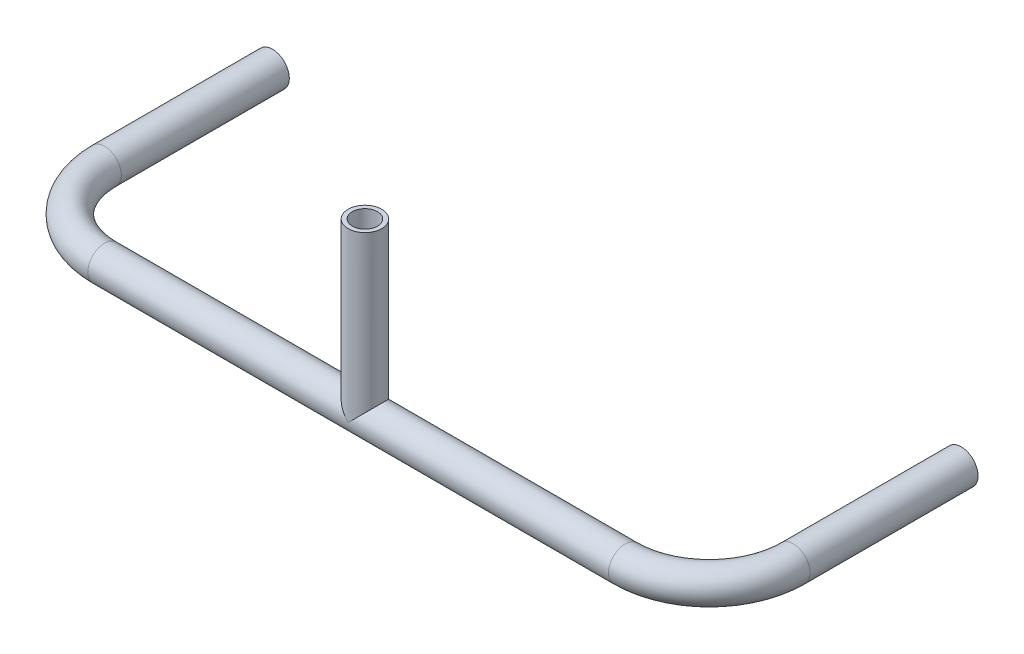
ISO-10303-21;
HEADER;
FILE_DESCRIPTION(('STEP AP214'),'2;1');
FILE_NAME('part.step','',(''),(''),'','','');
FILE_SCHEMA(('AUTOMOTIVE_DESIGN { 1 0 10303 214 1 1 1 1 }'));
ENDSEC;
DATA;
#1=APPLICATION_CONTEXT('core data for automotive mechanical design processes');
#2=APPLICATION_PROTOCOL_DEFINITION('international standard','automotive_design',2000,#1);
#3=PRODUCT_CONTEXT('',#1,'mechanical');
#4=PRODUCT('Part','Part','',(#3));
#5=PRODUCT_RELATED_PRODUCT_CATEGORY('part','',(#4));
#6=PRODUCT_DEFINITION_FORMATION('','',#4);
#7=PRODUCT_DEFINITION_CONTEXT('part definition',#1,'design');
#8=PRODUCT_DEFINITION('design','',#6,#7);
#9=PRODUCT_DEFINITION_SHAPE('','',#8);
#10=(LENGTH_UNIT() NAMED_UNIT(*) SI_UNIT(.MILLI.,.METRE.));
#11=(NAMED_UNIT(*) PLANE_ANGLE_UNIT() SI_UNIT($,.RADIAN.));
#12=(NAMED_UNIT(*) SI_UNIT($,.STERADIAN.) SOLID_ANGLE_UNIT());
#13=UNCERTAINTY_MEASURE_WITH_UNIT(LENGTH_MEASURE(1.E-05),#10,'distance_accuracy_value','');
#14=(GEOMETRIC_REPRESENTATION_CONTEXT(3) GLOBAL_UNCERTAINTY_ASSIGNED_CONTEXT((#13)) GLOBAL_UNIT_ASSIGNED_CONTEXT((#10,
#11,#12)) REPRESENTATION_CONTEXT('',''));
#15=CARTESIAN_POINT('',(0.,0.,0.));
#16=DIRECTION('',(0.,0.,1.));
#17=DIRECTION('',(1.,0.,0.));
#18=AXIS2_PLACEMENT_3D('',#15,#16,#17);
#19=CARTESIAN_POINT('',(-31.,0.,30.));
#20=DIRECTION('',(1.,0.,0.));
#21=DIRECTION('',(0.,0.,-1.));
#22=AXIS2_PLACEMENT_3D('',#19,#20,#21);
#23=CYLINDRICAL_SURFACE('',#22,2.);
#24=CARTESIAN_POINT('',(31.,0.,30.));
#25=DIRECTION('',(1.,0.,0.));
#26=DIRECTION('',(0.,0.,-1.));
#27=AXIS2_PLACEMENT_3D('',#24,#25,#26);
#28=CIRCLE('',#27,2.);
#29=CARTESIAN_POINT('',(31.,0.,32.));
#30=VERTEX_POINT('',#29);
#31=EDGE_CURVE('E123',#30,#30,#28,.T.);
#32=ORIENTED_EDGE('',*,*,#31,.F.);
#33=EDGE_LOOP('',(#32));
#34=FACE_BOUND('',#33,.T.);
#35=CARTESIAN_POINT('',(-31.,0.,30.));
#36=DIRECTION('',(1.,0.,0.));
#37=DIRECTION('',(0.,0.,-1.));
#38=AXIS2_PLACEMENT_3D('',#35,#36,#37);
#39=CIRCLE('',#38,2.);
#40=CARTESIAN_POINT('',(-31.,0.,32.));
#41=VERTEX_POINT('',#40);
#42=EDGE_CURVE('E92',#41,#41,#39,.T.);
#43=ORIENTED_EDGE('',*,*,#42,.T.);
#44=EDGE_LOOP('',(#43));
#45=FACE_BOUND('',#44,.T.);
#46=CARTESIAN_POINT('',(0.,0.,30.));
#47=DIRECTION('',(0.707106781186547,0.707106781186547,0.));
#48=DIRECTION('',(0.707106781186547,-0.707106781186547,0.));
#49=AXIS2_PLACEMENT_3D('',#46,#47,#48);
#50=ELLIPSE('',#49,2.82842712474619,2.);
#51=CARTESIAN_POINT('',(0.,0.,32.));
#52=VERTEX_POINT('',#51);
#53=CARTESIAN_POINT('',(0.,0.,28.));
#54=VERTEX_POINT('',#53);
#55=EDGE_CURVE('E81',#52,#54,#50,.F.);
#56=ORIENTED_EDGE('',*,*,#55,.T.);
#57=CARTESIAN_POINT('',(0.,0.,30.));
#58=DIRECTION('',(0.707106781186547,-0.707106781186547,0.));
#59=DIRECTION('',(0.707106781186547,0.707106781186547,0.));
#60=AXIS2_PLACEMENT_3D('',#57,#58,#59);
#61=ELLIPSE('',#60,2.82842712474619,2.);
#62=EDGE_CURVE('E85',#54,#52,#61,.T.);
#63=ORIENTED_EDGE('',*,*,#62,.T.);
#64=EDGE_LOOP('',(#56,#63));
#65=FACE_BOUND('',#64,.T.);
#66=ADVANCED_FACE('F33',(#34,#45,#65),#23,.T.);
#67=CARTESIAN_POINT('',(-31.,0.,30.));
#68=DIRECTION('',(1.,0.,0.));
#69=DIRECTION('',(0.,0.,-1.));
#70=AXIS2_PLACEMENT_3D('',#67,#68,#69);
#71=CYLINDRICAL_SURFACE('',#70,1.5);
#72=CARTESIAN_POINT('',(31.,0.,30.));
#73=DIRECTION('',(1.,0.,0.));
#74=DIRECTION('',(0.,0.,-1.));
#75=AXIS2_PLACEMENT_3D('',#72,#73,#74);
#76=CIRCLE('',#75,1.5);
#77=CARTESIAN_POINT('',(31.,0.,31.5));
#78=VERTEX_POINT('',#77);
#79=EDGE_CURVE('E105',#78,#78,#76,.F.);
#80=ORIENTED_EDGE('',*,*,#79,.F.);
#81=EDGE_LOOP('',(#80));
#82=FACE_BOUND('',#81,.T.);
#83=CARTESIAN_POINT('',(-31.,0.,30.));
#84=DIRECTION('',(1.,0.,0.));
#85=DIRECTION('',(0.,0.,-1.));
#86=AXIS2_PLACEMENT_3D('',#83,#84,#85);
#87=CIRCLE('',#86,1.5);
#88=CARTESIAN_POINT('',(-31.,0.,31.5));
#89=VERTEX_POINT('',#88);
#90=EDGE_CURVE('E102',#89,#89,#87,.F.);
#91=ORIENTED_EDGE('',*,*,#90,.T.);
#92=EDGE_LOOP('',(#91));
#93=FACE_BOUND('',#92,.T.);
#94=CARTESIAN_POINT('',(-1.32287565553229,0.,28.5));
#95=CARTESIAN_POINT('',(-1.3228472429083,0.0353540277200895,28.4999885169681));
#96=CARTESIAN_POINT('',(-1.32429221265618,0.0706884634475101,28.5012493349796));
#97=CARTESIAN_POINT('',(-1.32990588817293,0.140895201591939,28.506221233717));
#98=CARTESIAN_POINT('',(-1.33406891930621,0.175768312723147,28.5099272097313));
#99=CARTESIAN_POINT('',(-1.34482795294491,0.244336993641847,28.5196331506633));
#100=CARTESIAN_POINT('',(-1.35139206925062,0.278041929290358,28.5256030869254));
#101=CARTESIAN_POINT('',(-1.36661798881945,0.344516234957248,28.539704197805));
#102=CARTESIAN_POINT('',(-1.37528079832798,0.377285147736758,28.547836409336));
#103=CARTESIAN_POINT('',(-1.40370488220627,0.473407803270668,28.5751159164366));
#104=CARTESIAN_POINT('',(-1.42600935755767,0.535186087514595,28.5972364827325));
#105=CARTESIAN_POINT('',(-1.47476459266477,0.654137094366721,28.6485829654946));
#106=CARTESIAN_POINT('',(-1.50123060580581,0.711291653823556,28.6778352481754));
#107=CARTESIAN_POINT('',(-1.56178755816834,0.832138838856932,28.7496180760648));
#108=CARTESIAN_POINT('',(-1.59632058657662,0.894724411486535,28.7936445544965));
#109=CARTESIAN_POINT('',(-1.66524355065541,1.01257750797136,28.89071311794));
#110=CARTESIAN_POINT('',(-1.69963339467436,1.06784088606382,28.9437602718988));
#111=CARTESIAN_POINT('',(-1.77262218954202,1.18085283425442,29.0703835626529));
#112=CARTESIAN_POINT('',(-1.81064245765587,1.23679594018106,29.1459392819874));
#113=CARTESIAN_POINT('',(-1.87882277147525,1.33461489885807,29.3087948737559));
#114=CARTESIAN_POINT('',(-1.90899989364991,1.37652137130616,29.3960685935988));
#115=CARTESIAN_POINT('',(-1.95034276498561,1.4332079125303,29.5521316394577));
#116=CARTESIAN_POINT('',(-1.9644974007085,1.45235748702143,29.618555322986));
#117=CARTESIAN_POINT('',(-1.98605651335234,1.48139032483632,29.7544488244028));
#118=CARTESIAN_POINT('',(-1.9934669929493,1.49128182858409,29.8239158756782));
#119=CARTESIAN_POINT('',(-2.0009137556703,1.50122173279254,29.9641349109403));
#120=CARTESIAN_POINT('',(-2.00093080060058,1.50124445404499,30.0348897680472));
#121=CARTESIAN_POINT('',(-1.99354206403008,1.49138206224558,30.1753161663257));
#122=CARTESIAN_POINT('',(-1.98613456452867,1.48149465604221,30.2449874529756));
#123=CARTESIAN_POINT('',(-1.96491384779292,1.45291904092101,30.3788887647587));
#124=CARTESIAN_POINT('',(-1.95132875636653,1.43454391358972,30.4432234282423));
#125=CARTESIAN_POINT('',(-1.91882303252052,1.39000469971121,30.5676796993276));
#126=CARTESIAN_POINT('',(-1.89990116730859,1.36383881342441,30.6278003294786));
#127=CARTESIAN_POINT('',(-1.8556094193148,1.30146891282061,30.7492197853556));
#128=CARTESIAN_POINT('',(-1.82976310298697,1.2644845809908,30.8099408308793));
#129=CARTESIAN_POINT('',(-1.7746043687079,1.18326231558892,30.9245721098056));
#130=CARTESIAN_POINT('',(-1.74528931041261,1.13901884645955,30.9784770895392));
#131=CARTESIAN_POINT('',(-1.67894773984782,1.03479234754136,31.0890653471529));
#132=CARTESIAN_POINT('',(-1.64153762302545,0.973424737080219,31.1442142517069));
#133=CARTESIAN_POINT('',(-1.56727961917324,0.842204113770056,31.2439842098779));
#134=CARTESIAN_POINT('',(-1.53043234948672,0.772342444915624,31.2885943853027));
#135=CARTESIAN_POINT('',(-1.46815729672564,0.638936823735745,31.358774410104));
#136=CARTESIAN_POINT('',(-1.44190748461854,0.576843032275792,31.3863627576241));
#137=CARTESIAN_POINT('',(-1.39530793082902,0.447750299876172,31.4332486913795));
#138=CARTESIAN_POINT('',(-1.37492931764973,0.380777463879179,31.4525870806529));
#139=CARTESIAN_POINT('',(-1.34761494038507,0.261569041268139,31.4779032643405));
#140=CARTESIAN_POINT('',(-1.33852757924068,0.210306299580099,31.4860878317079));
#141=CARTESIAN_POINT('',(-1.32607404353961,0.106084980053789,31.4971817529948));
#142=CARTESIAN_POINT('',(-1.3227592152817,0.0531154088165287,31.5000437783481));
#143=CARTESIAN_POINT('',(-1.32287565553229,0.,31.5));
#144=B_SPLINE_CURVE_WITH_KNOTS('',3,(#94,#95,#96,#97,#98,#99,#100,#101,#102,#103,#104,#105,#106,
#107,#108,#109,#110,#111,#112,#113,#114,#115,#116,#117,#118,#119,#120,#121,#122,#123,#124,#125,
#126,#127,#128,#129,#130,#131,#132,#133,#134,#135,#136,#137,#138,#139,#140,#141,#142,#143),
.UNSPECIFIED.,.F.,.F.,(4,2,2,2,2,2,2,2,2,2,2,2,2,2,2,2,2,2,2,2,2,2,2,2,4),(0.,0.105978692080812,
0.211736831500518,0.316138680916848,0.420590686553714,0.627645209759532,0.835477148858311,
1.08646855873353,1.33760147596052,1.64012299148644,1.94198021812092,2.1527805645947,
2.36339310295551,2.57455366544316,2.78576310065994,2.98973737489542,3.1937588057396,
3.41987972813946,3.64617389055853,3.91692153092578,4.18794743068652,4.40579276866388,
4.62254782152896,4.78008215268932,4.93901071765423),.UNSPECIFIED.);
#145=CARTESIAN_POINT('',(-1.32287565553229,0.,28.5));
#146=VERTEX_POINT('',#145);
#147=CARTESIAN_POINT('',(-1.32287565553229,0.,31.5));
#148=VERTEX_POINT('',#147);
#149=EDGE_CURVE('E136',#146,#148,#144,.T.);
#150=ORIENTED_EDGE('',*,*,#149,.T.);
#151=DIRECTION('',(1.,0.,0.));
#152=VECTOR('',#151,1.);
#153=CARTESIAN_POINT('',(-31.,0.,31.5));
#154=LINE('',#153,#152);
#155=CARTESIAN_POINT('',(0.,0.,31.5));
#156=VERTEX_POINT('',#155);
#157=EDGE_CURVE('E48',#148,#156,#154,.T.);
#158=ORIENTED_EDGE('',*,*,#157,.T.);
#159=CARTESIAN_POINT('',(1.32287565553229,0.,31.5));
#160=VERTEX_POINT('',#159);
#161=EDGE_CURVE('E134',#156,#160,#154,.T.);
#162=ORIENTED_EDGE('',*,*,#161,.T.);
#163=CARTESIAN_POINT('',(1.32287565553229,0.,31.5));
#164=CARTESIAN_POINT('',(1.3228472429083,0.0353540277200903,31.5000114830319));
#165=CARTESIAN_POINT('',(1.32429221265618,0.0706884634475112,31.4987506650204));
#166=CARTESIAN_POINT('',(1.32990588817293,0.14089520159194,31.493778766283));
#167=CARTESIAN_POINT('',(1.33406891930621,0.175768312723149,31.4900727902687));
#168=CARTESIAN_POINT('',(1.34482795294491,0.244336993641849,31.4803668493367));
#169=CARTESIAN_POINT('',(1.35139206925062,0.278041929290361,31.4743969130746));
#170=CARTESIAN_POINT('',(1.36661798881945,0.34451623495725,31.460295802195));
#171=CARTESIAN_POINT('',(1.37528079832798,0.37728514773676,31.452163590664));
#172=CARTESIAN_POINT('',(1.40370488220627,0.473407803270669,31.4248840835634));
#173=CARTESIAN_POINT('',(1.42600935755766,0.535186087514595,31.4027635172675));
#174=CARTESIAN_POINT('',(1.47476459266477,0.65413709436672,31.3514170345054));
#175=CARTESIAN_POINT('',(1.50123060580581,0.711291653823555,31.3221647518246));
#176=CARTESIAN_POINT('',(1.56178755816834,0.832138838856931,31.2503819239352));
#177=CARTESIAN_POINT('',(1.59632058657662,0.894724411486535,31.2063554455035));
#178=CARTESIAN_POINT('',(1.66524355065541,1.01257750797136,31.10928688206));
#179=CARTESIAN_POINT('',(1.69963339467436,1.06784088606383,31.0562397281012));
#180=CARTESIAN_POINT('',(1.77262218954202,1.18085283425442,30.9296164373471));
#181=CARTESIAN_POINT('',(1.81064245765587,1.23679594018106,30.8540607180126));
#182=CARTESIAN_POINT('',(1.87882277147525,1.33461489885807,30.6912051262441));
#183=CARTESIAN_POINT('',(1.90899989364991,1.37652137130616,30.6039314064012));
#184=CARTESIAN_POINT('',(1.95034276498561,1.4332079125303,30.4478683605423));
#185=CARTESIAN_POINT('',(1.9644974007085,1.45235748702143,30.381444677014));
#186=CARTESIAN_POINT('',(1.98605651335234,1.48139032483632,30.2455511755972));
#187=CARTESIAN_POINT('',(1.9934669929493,1.49128182858409,30.1760841243218));
#188=CARTESIAN_POINT('',(2.0009137556703,1.50122173279254,30.0358650890597));
#189=CARTESIAN_POINT('',(2.00093080060058,1.50124445404499,29.9651102319528));
#190=CARTESIAN_POINT('',(1.99354206403008,1.49138206224558,29.8246838336743));
#191=CARTESIAN_POINT('',(1.98613456452867,1.48149465604221,29.7550125470244));
#192=CARTESIAN_POINT('',(1.96491384779292,1.45291904092101,29.6211112352413));
#193=CARTESIAN_POINT('',(1.95132875636653,1.43454391358972,29.5567765717577));
#194=CARTESIAN_POINT('',(1.91882303252052,1.39000469971121,29.4323203006725));
#195=CARTESIAN_POINT('',(1.89990116730859,1.36383881342441,29.3721996705215));
#196=CARTESIAN_POINT('',(1.8556094193148,1.30146891282061,29.2507802146444));
#197=CARTESIAN_POINT('',(1.82976310298697,1.2644845809908,29.1900591691207));
#198=CARTESIAN_POINT('',(1.7746043687079,1.18326231558892,29.0754278901944));
#199=CARTESIAN_POINT('',(1.74528931041261,1.13901884645955,29.0215229104608));
#200=CARTESIAN_POINT('',(1.67894773984782,1.03479234754136,28.9109346528471));
#201=CARTESIAN_POINT('',(1.64153762302546,0.973424737080219,28.8557857482931));
#202=CARTESIAN_POINT('',(1.56727961917324,0.842204113770058,28.7560157901221));
#203=CARTESIAN_POINT('',(1.53043234948673,0.772342444915627,28.7114056146973));
#204=CARTESIAN_POINT('',(1.46815729672564,0.638936823735749,28.6412255898961));
#205=CARTESIAN_POINT('',(1.44190748461854,0.576843032275796,28.6136372423759));
#206=CARTESIAN_POINT('',(1.39530793082902,0.447750299876175,28.5667513086205));
#207=CARTESIAN_POINT('',(1.37492931764973,0.380777463879182,28.5474129193471));
#208=CARTESIAN_POINT('',(1.34761494038507,0.261569041268141,28.5220967356595));
#209=CARTESIAN_POINT('',(1.33852757924068,0.210306299580101,28.5139121682921));
#210=CARTESIAN_POINT('',(1.32607404353961,0.10608498005379,28.5028182470052));
#211=CARTESIAN_POINT('',(1.3227592152817,0.0531154088165294,28.4999562216519));
#212=CARTESIAN_POINT('',(1.32287565553229,0.,28.5));
#213=B_SPLINE_CURVE_WITH_KNOTS('',3,(#163,#164,#165,#166,#167,#168,#169,#170,#171,#172,#173,
#174,#175,#176,#177,#178,#179,#180,#181,#182,#183,#184,#185,#186,#187,#188,#189,#190,#191,#192,
#193,#194,#195,#196,#197,#198,#199,#200,#201,#202,#203,#204,#205,#206,#207,#208,#209,#210,#211,
#212),.UNSPECIFIED.,.F.,.F.,(4,2,2,2,2,2,2,2,2,2,2,2,2,2,2,2,2,2,2,2,2,2,2,2,4),(0.,
0.105978692080813,0.21173683150052,0.31613868091685,0.420590686553713,0.627645209759531,
0.835477148858311,1.08646855873353,1.33760147596052,1.64012299148644,1.94198021812092,
2.1527805645947,2.36339310295551,2.57455366544316,2.78576310065994,2.98973737489542,
3.1937588057396,3.41987972813946,3.64617389055853,3.91692153092578,4.18794743068651,
4.40579276866388,4.62254782152896,4.78008215268932,4.93901071765423),.UNSPECIFIED.);
#214=CARTESIAN_POINT('',(1.32287565553229,0.,28.5));
#215=VERTEX_POINT('',#214);
#216=EDGE_CURVE('E37',#160,#215,#213,.T.);
#217=ORIENTED_EDGE('',*,*,#216,.T.);
#218=DIRECTION('',(1.,0.,0.));
#219=VECTOR('',#218,1.);
#220=CARTESIAN_POINT('',(-31.,0.,28.5));
#221=LINE('',#220,#219);
#222=CARTESIAN_POINT('',(0.,0.,28.5));
#223=VERTEX_POINT('',#222);
#224=EDGE_CURVE('E135',#215,#223,#221,.F.);
#225=ORIENTED_EDGE('',*,*,#224,.T.);
#226=EDGE_CURVE('E132',#223,#146,#221,.F.);
#227=ORIENTED_EDGE('',*,*,#226,.T.);
#228=EDGE_LOOP('',(#150,#158,#162,#217,#225,#227));
#229=FACE_BOUND('',#228,.T.);
#230=ADVANCED_FACE('F173',(#82,#93,#229),#71,.F.);
#231=CARTESIAN_POINT('',(-41.,0.,0.));
#232=DIRECTION('',(0.,0.,1.));
#233=DIRECTION('',(1.,0.,0.));
#234=AXIS2_PLACEMENT_3D('',#231,#232,#233);
#235=CYLINDRICAL_SURFACE('',#234,2.);
#236=CARTESIAN_POINT('',(-41.,0.,20.));
#237=DIRECTION('',(0.,0.,1.));
#238=DIRECTION('',(1.,0.,0.));
#239=AXIS2_PLACEMENT_3D('',#236,#237,#238);
#240=CIRCLE('',#239,2.);
#241=CARTESIAN_POINT('',(-43.,0.,20.));
#242=VERTEX_POINT('',#241);
#243=EDGE_CURVE('E89',#242,#242,#240,.T.);
#244=ORIENTED_EDGE('',*,*,#243,.F.);
#245=EDGE_LOOP('',(#244));
#246=FACE_BOUND('',#245,.T.);
#247=CARTESIAN_POINT('',(-41.,0.,0.));
#248=DIRECTION('',(0.,0.,1.));
#249=DIRECTION('',(1.,0.,0.));
#250=AXIS2_PLACEMENT_3D('',#247,#248,#249);
#251=CIRCLE('',#250,2.);
#252=CARTESIAN_POINT('',(-39.,0.,0.));
#253=VERTEX_POINT('',#252);
#254=EDGE_CURVE('E117',#253,#253,#251,.T.);
#255=ORIENTED_EDGE('',*,*,#254,.T.);
#256=EDGE_LOOP('',(#255));
#257=FACE_BOUND('',#256,.T.);
#258=ADVANCED_FACE('F180',(#246,#257),#235,.T.);
#259=CARTESIAN_POINT('',(-31.,0.,20.));
#260=DIRECTION('',(0.,1.,0.));
#261=DIRECTION('',(0.,0.,1.));
#262=AXIS2_PLACEMENT_3D('',#259,#260,#261);
#263=TOROIDAL_SURFACE('',#262,10.,2.);
#264=CARTESIAN_POINT('',(-31.,0.,20.));
#265=DIRECTION('',(0.,1.,0.));
#266=DIRECTION('',(0.,0.,1.));
#267=AXIS2_PLACEMENT_3D('',#264,#265,#266);
#268=CIRCLE('',#267,12.);
#269=EDGE_CURVE('',#242,#41,#268,.T.);
#270=ORIENTED_EDGE('',*,*,#243,.T.);
#271=ORIENTED_EDGE('',*,*,#42,.F.);
#272=ORIENTED_EDGE('',*,*,#269,.T.);
#273=ORIENTED_EDGE('',*,*,#269,.F.);
#274=EDGE_LOOP('',(#270,#272,#271,#273));
#275=FACE_BOUND('',#274,.T.);
#276=ADVANCED_FACE('F227',(#275),#263,.T.);
#277=CARTESIAN_POINT('',(31.,0.,20.));
#278=DIRECTION('',(0.,1.,0.));
#279=DIRECTION('',(0.,0.,1.));
#280=AXIS2_PLACEMENT_3D('',#277,#278,#279);
#281=TOROIDAL_SURFACE('',#280,10.,2.);
#282=CARTESIAN_POINT('',(41.,0.,20.));
#283=DIRECTION('',(0.,0.,-1.));
#284=DIRECTION('',(-1.,0.,0.));
#285=AXIS2_PLACEMENT_3D('',#282,#283,#284);
#286=CIRCLE('',#285,2.);
#287=CARTESIAN_POINT('',(43.,0.,20.));
#288=VERTEX_POINT('',#287);
#289=EDGE_CURVE('E119',#288,#288,#286,.T.);
#290=CARTESIAN_POINT('',(31.,0.,20.));
#291=DIRECTION('',(0.,1.,0.));
#292=DIRECTION('',(0.,0.,1.));
#293=AXIS2_PLACEMENT_3D('',#290,#291,#292);
#294=CIRCLE('',#293,12.);
#295=EDGE_CURVE('',#30,#288,#294,.T.);
#296=ORIENTED_EDGE('',*,*,#31,.T.);
#297=ORIENTED_EDGE('',*,*,#289,.F.);
#298=ORIENTED_EDGE('',*,*,#295,.T.);
#299=ORIENTED_EDGE('',*,*,#295,.F.);
#300=EDGE_LOOP('',(#296,#298,#297,#299));
#301=FACE_BOUND('',#300,.T.);
#302=ADVANCED_FACE('F233',(#301),#281,.T.);
#303=CARTESIAN_POINT('',(41.,0.,20.));
#304=DIRECTION('',(0.,0.,-1.));
#305=DIRECTION('',(-1.,0.,0.));
#306=AXIS2_PLACEMENT_3D('',#303,#304,#305);
#307=CYLINDRICAL_SURFACE('',#306,2.);
#308=CARTESIAN_POINT('',(41.,0.,0.));
#309=DIRECTION('',(0.,0.,-1.));
#310=DIRECTION('',(-1.,0.,0.));
#311=AXIS2_PLACEMENT_3D('',#308,#309,#310);
#312=CIRCLE('',#311,2.);
#313=CARTESIAN_POINT('',(39.,0.,0.));
#314=VERTEX_POINT('',#313);
#315=EDGE_CURVE('E99',#314,#314,#312,.T.);
#316=ORIENTED_EDGE('',*,*,#315,.F.);
#317=EDGE_LOOP('',(#316));
#318=FACE_BOUND('',#317,.T.);
#319=ORIENTED_EDGE('',*,*,#289,.T.);
#320=EDGE_LOOP('',(#319));
#321=FACE_BOUND('',#320,.T.);
#322=ADVANCED_FACE('F35',(#318,#321),#307,.T.);
#323=CARTESIAN_POINT('',(-41.,0.,0.));
#324=DIRECTION('',(0.,0.,1.));
#325=DIRECTION('',(1.,0.,0.));
#326=AXIS2_PLACEMENT_3D('',#323,#324,#325);
#327=PLANE('',#326);
#328=CARTESIAN_POINT('',(-41.,0.,0.));
#329=DIRECTION('',(0.,0.,1.));
#330=DIRECTION('',(1.,0.,0.));
#331=AXIS2_PLACEMENT_3D('',#328,#329,#330);
#332=CIRCLE('',#331,1.5);
#333=CARTESIAN_POINT('',(-39.5,0.,0.));
#334=VERTEX_POINT('',#333);
#335=EDGE_CURVE('E95',#334,#334,#332,.F.);
#336=ORIENTED_EDGE('',*,*,#335,.F.);
#337=EDGE_LOOP('',(#336));
#338=FACE_BOUND('',#337,.T.);
#339=ORIENTED_EDGE('',*,*,#254,.F.);
#340=EDGE_LOOP('',(#339));
#341=FACE_BOUND('',#340,.T.);
#342=ADVANCED_FACE('F238',(#338,#341),#327,.F.);
#343=CARTESIAN_POINT('',(41.,0.,0.));
#344=DIRECTION('',(0.,0.,-1.));
#345=DIRECTION('',(-1.,0.,0.));
#346=AXIS2_PLACEMENT_3D('',#343,#344,#345);
#347=PLANE('',#346);
#348=CARTESIAN_POINT('',(41.,0.,0.));
#349=DIRECTION('',(0.,0.,-1.));
#350=DIRECTION('',(-1.,0.,0.));
#351=AXIS2_PLACEMENT_3D('',#348,#349,#350);
#352=CIRCLE('',#351,1.5);
#353=CARTESIAN_POINT('',(39.5,0.,0.));
#354=VERTEX_POINT('',#353);
#355=EDGE_CURVE('E111',#354,#354,#352,.F.);
#356=ORIENTED_EDGE('',*,*,#355,.T.);
#357=EDGE_LOOP('',(#356));
#358=FACE_BOUND('',#357,.T.);
#359=ORIENTED_EDGE('',*,*,#315,.T.);
#360=EDGE_LOOP('',(#359));
#361=FACE_BOUND('',#360,.T.);
#362=ADVANCED_FACE('F160',(#358,#361),#347,.T.);
#363=CARTESIAN_POINT('',(-41.,0.,0.));
#364=DIRECTION('',(0.,0.,1.));
#365=DIRECTION('',(1.,0.,0.));
#366=AXIS2_PLACEMENT_3D('',#363,#364,#365);
#367=CYLINDRICAL_SURFACE('',#366,1.5);
#368=CARTESIAN_POINT('',(-41.,0.,20.));
#369=DIRECTION('',(0.,0.,1.));
#370=DIRECTION('',(1.,0.,0.));
#371=AXIS2_PLACEMENT_3D('',#368,#369,#370);
#372=CIRCLE('',#371,1.5);
#373=CARTESIAN_POINT('',(-42.5,0.,20.));
#374=VERTEX_POINT('',#373);
#375=EDGE_CURVE('E98',#374,#374,#372,.F.);
#376=ORIENTED_EDGE('',*,*,#375,.F.);
#377=EDGE_LOOP('',(#376));
#378=FACE_BOUND('',#377,.T.);
#379=ORIENTED_EDGE('',*,*,#335,.T.);
#380=EDGE_LOOP('',(#379));
#381=FACE_BOUND('',#380,.T.);
#382=ADVANCED_FACE('F156',(#378,#381),#367,.F.);
#383=CARTESIAN_POINT('',(-31.,0.,20.));
#384=DIRECTION('',(0.,1.,0.));
#385=DIRECTION('',(0.,0.,1.));
#386=AXIS2_PLACEMENT_3D('',#383,#384,#385);
#387=TOROIDAL_SURFACE('',#386,10.,1.5);
#388=CARTESIAN_POINT('',(-31.,0.,20.));
#389=DIRECTION('',(0.,1.,0.));
#390=DIRECTION('',(0.,0.,1.));
#391=AXIS2_PLACEMENT_3D('',#388,#389,#390);
#392=CIRCLE('',#391,11.5);
#393=EDGE_CURVE('',#374,#89,#392,.T.);
#394=ORIENTED_EDGE('',*,*,#375,.T.);
#395=ORIENTED_EDGE('',*,*,#90,.F.);
#396=ORIENTED_EDGE('',*,*,#393,.T.);
#397=ORIENTED_EDGE('',*,*,#393,.F.);
#398=EDGE_LOOP('',(#394,#396,#395,#397));
#399=FACE_BOUND('',#398,.T.);
#400=ADVANCED_FACE('F159',(#399),#387,.F.);
#401=CARTESIAN_POINT('',(31.,0.,20.));
#402=DIRECTION('',(0.,1.,0.));
#403=DIRECTION('',(0.,0.,1.));
#404=AXIS2_PLACEMENT_3D('',#401,#402,#403);
#405=TOROIDAL_SURFACE('',#404,10.,1.5);
#406=CARTESIAN_POINT('',(41.,0.,20.));
#407=DIRECTION('',(0.,0.,-1.));
#408=DIRECTION('',(-1.,0.,0.));
#409=AXIS2_PLACEMENT_3D('',#406,#407,#408);
#410=CIRCLE('',#409,1.5);
#411=CARTESIAN_POINT('',(42.5,0.,20.));
#412=VERTEX_POINT('',#411);
#413=EDGE_CURVE('E108',#412,#412,#410,.F.);
#414=CARTESIAN_POINT('',(31.,0.,20.));
#415=DIRECTION('',(0.,1.,0.));
#416=DIRECTION('',(0.,0.,1.));
#417=AXIS2_PLACEMENT_3D('',#414,#415,#416);
#418=CIRCLE('',#417,11.5);
#419=EDGE_CURVE('',#78,#412,#418,.T.);
#420=ORIENTED_EDGE('',*,*,#79,.T.);
#421=ORIENTED_EDGE('',*,*,#413,.F.);
#422=ORIENTED_EDGE('',*,*,#419,.T.);
#423=ORIENTED_EDGE('',*,*,#419,.F.);
#424=EDGE_LOOP('',(#420,#422,#421,#423));
#425=FACE_BOUND('',#424,.T.);
#426=ADVANCED_FACE('F163',(#425),#405,.F.);
#427=CARTESIAN_POINT('',(41.,0.,20.));
#428=DIRECTION('',(0.,0.,-1.));
#429=DIRECTION('',(-1.,0.,0.));
#430=AXIS2_PLACEMENT_3D('',#427,#428,#429);
#431=CYLINDRICAL_SURFACE('',#430,1.5);
#432=ORIENTED_EDGE('',*,*,#355,.F.);
#433=EDGE_LOOP('',(#432));
#434=FACE_BOUND('',#433,.T.);
#435=ORIENTED_EDGE('',*,*,#413,.T.);
#436=EDGE_LOOP('',(#435));
#437=FACE_BOUND('',#436,.T.);
#438=ADVANCED_FACE('F168',(#434,#437),#431,.F.);
#439=CARTESIAN_POINT('',(0.,20.,30.));
#440=DIRECTION('',(0.,-1.,0.));
#441=DIRECTION('',(0.,0.,-1.));
#442=AXIS2_PLACEMENT_3D('',#439,#440,#441);
#443=CYLINDRICAL_SURFACE('',#442,1.5);
#444=CARTESIAN_POINT('',(0.,0.,30.));
#445=DIRECTION('',(0.,1.,0.));
#446=DIRECTION('',(0.,0.,1.));
#447=AXIS2_PLACEMENT_3D('',#444,#445,#446);
#448=CIRCLE('',#447,1.5);
#449=EDGE_CURVE('E62',#223,#156,#448,.T.);
#450=ORIENTED_EDGE('',*,*,#449,.F.);
#451=CARTESIAN_POINT('',(0.,0.,30.));
#452=DIRECTION('',(0.707106781186547,0.707106781186547,0.));
#453=DIRECTION('',(0.707106781186547,-0.707106781186547,0.));
#454=AXIS2_PLACEMENT_3D('',#451,#452,#453);
#455=ELLIPSE('',#454,2.12132034355965,1.5);
#456=EDGE_CURVE('E114',#223,#156,#455,.T.);
#457=ORIENTED_EDGE('',*,*,#456,.T.);
#458=EDGE_LOOP('',(#450,#457));
#459=FACE_BOUND('',#458,.T.);
#460=ADVANCED_FACE('F151',(#459),#443,.F.);
#461=CARTESIAN_POINT('',(0.,20.,30.));
#462=DIRECTION('',(0.,-1.,0.));
#463=DIRECTION('',(0.,0.,-1.));
#464=AXIS2_PLACEMENT_3D('',#461,#462,#463);
#465=CYLINDRICAL_SURFACE('',#464,2.);
#466=ORIENTED_EDGE('',*,*,#149,.F.);
#467=CARTESIAN_POINT('',(0.,0.,30.));
#468=DIRECTION('',(0.,1.,0.));
#469=DIRECTION('',(0.,0.,1.));
#470=AXIS2_PLACEMENT_3D('',#467,#468,#469);
#471=CIRCLE('',#470,2.);
#472=EDGE_CURVE('E204',#146,#148,#471,.T.);
#473=ORIENTED_EDGE('',*,*,#472,.T.);
#474=EDGE_LOOP('',(#466,#473));
#475=FACE_BOUND('',#474,.T.);
#476=ADVANCED_FACE('F145',(#475),#465,.T.);
#477=CARTESIAN_POINT('',(0.,0.,30.));
#478=DIRECTION('',(0.,1.,0.));
#479=DIRECTION('',(0.,0.,1.));
#480=AXIS2_PLACEMENT_3D('',#477,#478,#479);
#481=PLANE('',#480);
#482=ORIENTED_EDGE('',*,*,#157,.F.);
#483=ORIENTED_EDGE('',*,*,#472,.F.);
#484=ORIENTED_EDGE('',*,*,#226,.F.);
#485=ORIENTED_EDGE('',*,*,#449,.T.);
#486=EDGE_LOOP('',(#482,#483,#484,#485));
#487=FACE_BOUND('',#486,.T.);
#488=ADVANCED_FACE('F150',(#487),#481,.F.);
#489=CARTESIAN_POINT('',(0.,0.,30.));
#490=DIRECTION('',(0.707106781186547,-0.707106781186547,0.));
#491=DIRECTION('',(0.707106781186547,0.707106781186547,0.));
#492=AXIS2_PLACEMENT_3D('',#489,#490,#491);
#493=ELLIPSE('',#492,2.12132034355965,1.5);
#494=EDGE_CURVE('E129',#156,#223,#493,.F.);
#495=ORIENTED_EDGE('',*,*,#494,.F.);
#496=ORIENTED_EDGE('',*,*,#456,.F.);
#497=EDGE_LOOP('',(#495,#496));
#498=FACE_BOUND('',#497,.T.);
#499=ADVANCED_FACE('F141',(#498),#71,.F.);
#500=ORIENTED_EDGE('',*,*,#216,.F.);
#501=EDGE_CURVE('E208',#160,#215,#471,.T.);
#502=ORIENTED_EDGE('',*,*,#501,.T.);
#503=EDGE_LOOP('',(#500,#502));
#504=FACE_BOUND('',#503,.T.);
#505=ADVANCED_FACE('F153',(#504),#465,.T.);
#506=EDGE_CURVE('E205',#156,#223,#448,.T.);
#507=ORIENTED_EDGE('',*,*,#506,.F.);
#508=ORIENTED_EDGE('',*,*,#494,.T.);
#509=EDGE_LOOP('',(#507,#508));
#510=FACE_BOUND('',#509,.T.);
#511=ADVANCED_FACE('F199',(#510),#443,.F.);
#512=ORIENTED_EDGE('',*,*,#161,.F.);
#513=ORIENTED_EDGE('',*,*,#506,.T.);
#514=ORIENTED_EDGE('',*,*,#224,.F.);
#515=ORIENTED_EDGE('',*,*,#501,.F.);
#516=EDGE_LOOP('',(#512,#513,#514,#515));
#517=FACE_BOUND('',#516,.T.);
#518=ADVANCED_FACE('F154',(#517),#481,.F.);
#519=ORIENTED_EDGE('',*,*,#62,.F.);
#520=ORIENTED_EDGE('',*,*,#55,.F.);
#521=EDGE_LOOP('',(#519,#520));
#522=FACE_BOUND('',#521,.T.);
#523=CARTESIAN_POINT('',(0.,20.,30.));
#524=DIRECTION('',(0.,1.,0.));
#525=DIRECTION('',(0.,0.,1.));
#526=AXIS2_PLACEMENT_3D('',#523,#524,#525);
#527=CIRCLE('',#526,2.);
#528=CARTESIAN_POINT('',(0.,20.,32.));
#529=VERTEX_POINT('',#528);
#530=EDGE_CURVE('E87',#529,#529,#527,.T.);
#531=ORIENTED_EDGE('',*,*,#530,.F.);
#532=EDGE_LOOP('',(#531));
#533=FACE_BOUND('',#532,.T.);
#534=ADVANCED_FACE('F83',(#522,#533),#465,.T.);
#535=CARTESIAN_POINT('',(0.,1.3228756555323,28.5));
#536=CARTESIAN_POINT('',(0.0699974234256294,1.32289190044095,28.5000078095055));
#537=CARTESIAN_POINT('',(0.140045834311918,1.32856366615417,28.5049589092558));
#538=CARTESIAN_POINT('',(0.27732985620948,1.34990644032802,28.5242166678959));
#539=CARTESIAN_POINT('',(0.344556445019508,1.36560725168671,28.5385512143441));
#540=CARTESIAN_POINT('',(0.473579846738377,1.40375127916871,28.5751616100815));
#541=CARTESIAN_POINT('',(0.535438776762465,1.42609848244815,28.5973251655504));
#542=CARTESIAN_POINT('',(0.654345454445195,1.47486455031268,28.6486934470064));
#543=CARTESIAN_POINT('',(0.71139378246922,1.50128292264932,28.6778973219831));
#544=CARTESIAN_POINT('',(0.832112796316594,1.56177312961147,28.7496009018895));
#545=CARTESIAN_POINT('',(0.894667934226478,1.59628904009787,28.7936042604964));
#546=CARTESIAN_POINT('',(1.01252546624227,1.66521164096379,28.8906640324069));
#547=CARTESIAN_POINT('',(1.06781696482027,1.69961809339877,28.943733777172));
#548=CARTESIAN_POINT('',(1.18085873865547,1.77262582436251,29.0703898077475));
#549=CARTESIAN_POINT('',(1.23680596671986,1.81064921229759,29.1459527108578));
#550=CARTESIAN_POINT('',(1.33462220828284,1.87882809751632,29.3088102851781));
#551=CARTESIAN_POINT('',(1.37652429746881,1.90900204180106,29.3960767061638));
#552=CARTESIAN_POINT('',(1.43320768590294,1.95034258990248,29.5521309760164));
#553=CARTESIAN_POINT('',(1.45235709597847,1.96449710921007,29.6185539503075));
#554=CARTESIAN_POINT('',(1.48139011599675,1.98605635937555,29.7544473906835));
#555=CARTESIAN_POINT('',(1.49128177610674,1.99346695432364,29.8239151540048));
#556=CARTESIAN_POINT('',(1.50122173386249,2.00091375578087,29.964134907378));
#557=CARTESIAN_POINT('',(1.50124445437644,2.00093080057496,30.0348897591186));
#558=CARTESIAN_POINT('',(1.49138206321971,1.99354206503066,30.175316156674));
#559=CARTESIAN_POINT('',(1.48149465709185,1.98613456571338,30.2449874478222));
#560=CARTESIAN_POINT('',(1.45291894941013,1.96491377944411,30.3788891937927));
#561=CARTESIAN_POINT('',(1.43454367361292,1.9513285776568,30.4432242682363));
#562=CARTESIAN_POINT('',(1.39000435781776,1.91882278657017,30.5676804850464));
#563=CARTESIAN_POINT('',(1.36383861948684,1.89990103394194,30.6278007050336));
#564=CARTESIAN_POINT('',(1.30147038485468,1.85561045984505,30.7492169218647));
#565=CARTESIAN_POINT('',(1.26448790338124,1.82976540608097,30.8099353847136));
#566=CARTESIAN_POINT('',(1.18326629602949,1.77460702483739,30.9245672505483));
#567=CARTESIAN_POINT('',(1.1390209863001,1.74529074780454,30.9784747846212));
#568=CARTESIAN_POINT('',(1.03477665117905,1.6789376587236,31.0890820428333));
#569=CARTESIAN_POINT('',(0.973390789973598,1.64151655866368,31.1442449300479));
#570=CARTESIAN_POINT('',(0.842165416378052,1.5672595828377,31.2440087555623));
#571=CARTESIAN_POINT('',(0.772321900474934,1.53042399363524,31.2886046621148));
#572=CARTESIAN_POINT('',(0.639018129754369,1.4681942599916,31.358732064116));
#573=CARTESIAN_POINT('',(0.577012954699347,1.44197599789983,31.386288668681));
#574=CARTESIAN_POINT('',(0.447934718580615,1.39536741257394,31.4331939710878));
#575=CARTESIAN_POINT('',(0.380873520309631,1.37496395320512,31.4525612180826));
#576=CARTESIAN_POINT('',(0.256313056001676,1.34640050620232,31.4790238535067));
#577=CARTESIAN_POINT('',(0.199552917883138,1.33661539556871,31.4877906949658));
#578=CARTESIAN_POINT('',(0.0846445338261716,1.32435588438334,31.4987176061979));
#579=CARTESIAN_POINT('',(0.0264981600971762,1.32187213058308,31.5008861287327));
#580=CARTESIAN_POINT('',(-0.0894789917334012,1.32462868790498,31.4984527011555));
#581=CARTESIAN_POINT('',(-0.147309645809676,1.32987184207164,31.4938482589949));
#582=CARTESIAN_POINT('',(-0.261076152442875,1.34721218775047,31.4782252727197));
#583=CARTESIAN_POINT('',(-0.317008597948106,1.35932107727346,31.467195780564));
#584=CARTESIAN_POINT('',(-0.446338044938873,1.39427758287802,31.4341395956239));
#585=CARTESIAN_POINT('',(-0.518435953915031,1.41944823697316,31.4095418976924));
#586=CARTESIAN_POINT('',(-0.656307663640118,1.47537861079976,31.3508887783844));
#587=CARTESIAN_POINT('',(-0.722069517294751,1.50614858477231,31.3168159433548));
#588=CARTESIAN_POINT('',(-0.849349008048124,1.5710828237565,31.238697741167));
#589=CARTESIAN_POINT('',(-0.91063287621826,1.60532883846046,31.1943411006034));
#590=CARTESIAN_POINT('',(-1.02600209636125,1.67347506272362,31.0968256291459));
#591=CARTESIAN_POINT('',(-1.08008392798894,1.70737509574666,31.0436625219446));
#592=CARTESIAN_POINT('',(-1.19127699162937,1.77960222623533,30.9162345138296));
#593=CARTESIAN_POINT('',(-1.2464752388576,1.81728174165357,30.8398962709469));
#594=CARTESIAN_POINT('',(-1.34262073345088,1.88453104769826,30.6755516126513));
#595=CARTESIAN_POINT('',(-1.3835988245813,1.91411836052284,30.5875710299748));
#596=CARTESIAN_POINT('',(-1.43843799144687,1.9541940640238,30.4307556614969));
#597=CARTESIAN_POINT('',(-1.45675679327544,1.9677547802964,30.3642500573275));
#598=CARTESIAN_POINT('',(-1.48412879630752,1.98810265589123,30.2283644649644));
#599=CARTESIAN_POINT('',(-1.49319028154851,1.9948958710696,30.1589871045619));
#600=CARTESIAN_POINT('',(-1.5015163909286,2.00113566717063,30.0191476059404));
#601=CARTESIAN_POINT('',(-1.50075801734825,2.00056500218907,29.9486833074129));
#602=CARTESIAN_POINT('',(-1.48943900869876,1.99208803243811,29.8089909889699));
#603=CARTESIAN_POINT('',(-1.47887576229252,1.98417977344351,29.7397633034087));
#604=CARTESIAN_POINT('',(-1.44902508383276,1.96203400925195,29.606478064745));
#605=CARTESIAN_POINT('',(-1.42999981867845,1.94798690792879,29.5423287634886));
#606=CARTESIAN_POINT('',(-1.38421193438106,1.91462720575137,29.4183386569026));
#607=CARTESIAN_POINT('',(-1.35744766016908,1.89531347862387,29.3584987766112));
#608=CARTESIAN_POINT('',(-1.29372206240403,1.85017642210641,29.2374523012332));
#609=CARTESIAN_POINT('',(-1.25594906864041,1.82386352707581,29.1768587632866));
#610=CARTESIAN_POINT('',(-1.17313355944578,1.76785506075717,29.0625851882758));
#611=CARTESIAN_POINT('',(-1.12808436271395,1.73815638795658,29.0089115876166));
#612=CARTESIAN_POINT('',(-1.0219946334392,1.67106353042106,28.8988761933932));
#613=CARTESIAN_POINT('',(-0.95955360056009,1.63330922504697,28.84408308458));
#614=CARTESIAN_POINT('',(-0.826131928100119,1.55866082463332,28.7452474657065));
#615=CARTESIAN_POINT('',(-0.75514817396343,1.52176704921892,28.7012088944327));
#616=CARTESIAN_POINT('',(-0.621116749409688,1.46049601449285,28.6330402869855));
#617=CARTESIAN_POINT('',(-0.559665017293437,1.43513625007637,28.60666473662));
#618=CARTESIAN_POINT('',(-0.431917086944114,1.39032564651233,28.561946019714));
#619=CARTESIAN_POINT('',(-0.365634308404544,1.37085915899696,28.5435815232166));
#620=CARTESIAN_POINT('',(-0.249211780403066,1.34532423383262,28.5200294224362));
#621=CARTESIAN_POINT('',(-0.200032928709532,1.3370013026568,28.5125575097313));
#622=CARTESIAN_POINT('',(-0.100577666966344,1.32577295392455,28.5025416092755));
#623=CARTESIAN_POINT('',(-0.0503019990562728,1.32286398151146,28.4999943878829));
#624=CARTESIAN_POINT('',(0.,1.3228756555323,28.5));
#625=B_SPLINE_CURVE_WITH_KNOTS('',3,(#535,#536,#537,#538,#539,#540,#541,#542,#543,#544,#545,
#546,#547,#548,#549,#550,#551,#552,#553,#554,#555,#556,#557,#558,#559,#560,#561,#562,#563,#564,
#565,#566,#567,#568,#569,#570,#571,#572,#573,#574,#575,#576,#577,#578,#579,#580,#581,#582,#583,
#584,#585,#586,#587,#588,#589,#590,#591,#592,#593,#594,#595,#596,#597,#598,#599,#600,#601,#602,
#603,#604,#605,#606,#607,#608,#609,#610,#611,#612,#613,#614,#615,#616,#617,#618,#619,#620,#621,
#622,#623,#624),.UNSPECIFIED.,.T.,.F.,(4,2,2,2,2,2,2,2,2,2,2,2,2,2,2,2,2,2,2,2,2,2,2,2,2,2,2,2,
2,2,2,2,2,2,2,2,2,2,2,2,2,2,2,2,4),(0.,0.20973177668449,0.420089722582995,0.62754538562014,
0.834975984672347,1.08585208691169,1.33710031031849,1.63964848103538,1.94147907444964,
2.15227725277555,2.36289195870711,2.57405250727807,2.78526195641289,2.9892375589505,
3.1932576610867,3.41936844116895,3.64567274887664,3.91649517204702,4.18744629647933,
4.40499409477197,4.62204646613006,4.79608005545901,4.96989060538193,5.14376512326213,
5.31793678696019,5.55730028202398,5.79710662639151,6.04543209090061,6.29387849446619,
6.59652499511464,6.89851088586566,7.10852896194427,7.31835893539181,7.52868041101044,
7.73905791773945,7.94332812691912,8.14764205379333,8.37510052489611,8.60276905744645,
8.87547580578156,9.14828228208532,9.36218279640836,9.57551025772699,9.72632812073767,
9.87704692032409),.UNSPECIFIED.);
#626=CARTESIAN_POINT('',(0.,1.3228756555323,28.5));
#627=VERTEX_POINT('',#626);
#628=EDGE_CURVE('E11',#627,#627,#625,.T.);
#629=ORIENTED_EDGE('',*,*,#628,.T.);
#630=EDGE_LOOP('',(#629));
#631=FACE_BOUND('',#630,.T.);
#632=CARTESIAN_POINT('',(0.,20.,30.));
#633=DIRECTION('',(0.,1.,0.));
#634=DIRECTION('',(0.,0.,1.));
#635=AXIS2_PLACEMENT_3D('',#632,#633,#634);
#636=CIRCLE('',#635,1.5);
#637=CARTESIAN_POINT('',(0.,20.,31.5));
#638=VERTEX_POINT('',#637);
#639=EDGE_CURVE('E202',#638,#638,#636,.T.);
#640=ORIENTED_EDGE('',*,*,#639,.T.);
#641=EDGE_LOOP('',(#640));
#642=FACE_BOUND('',#641,.T.);
#643=ADVANCED_FACE('F192',(#631,#642),#443,.F.);
#644=CARTESIAN_POINT('',(0.,20.,30.));
#645=DIRECTION('',(0.,1.,0.));
#646=DIRECTION('',(0.,0.,1.));
#647=AXIS2_PLACEMENT_3D('',#644,#645,#646);
#648=PLANE('',#647);
#649=ORIENTED_EDGE('',*,*,#530,.T.);
#650=EDGE_LOOP('',(#649));
#651=FACE_BOUND('',#650,.T.);
#652=ORIENTED_EDGE('',*,*,#639,.F.);
#653=EDGE_LOOP('',(#652));
#654=FACE_BOUND('',#653,.T.);
#655=ADVANCED_FACE('F187',(#651,#654),#648,.T.);
#656=ORIENTED_EDGE('',*,*,#628,.F.);
#657=EDGE_LOOP('',(#656));
#658=FACE_BOUND('',#657,.T.);
#659=ADVANCED_FACE('F176',(#658),#23,.T.);
#660=CLOSED_SHELL('',(#66,#230,#258,#276,#302,#322,#342,#362,#382,#400,#426,#438,#460,#476,#488,
#499,#505,#511,#518,#534,#643,#655,#659));
#661=MANIFOLD_SOLID_BREP('B2',#660);
#662=ADVANCED_BREP_SHAPE_REPRESENTATION('',(#18,#661),#14);
#663=SHAPE_DEFINITION_REPRESENTATION(#9,#662);
ENDSEC;
END-ISO-10303-21;
